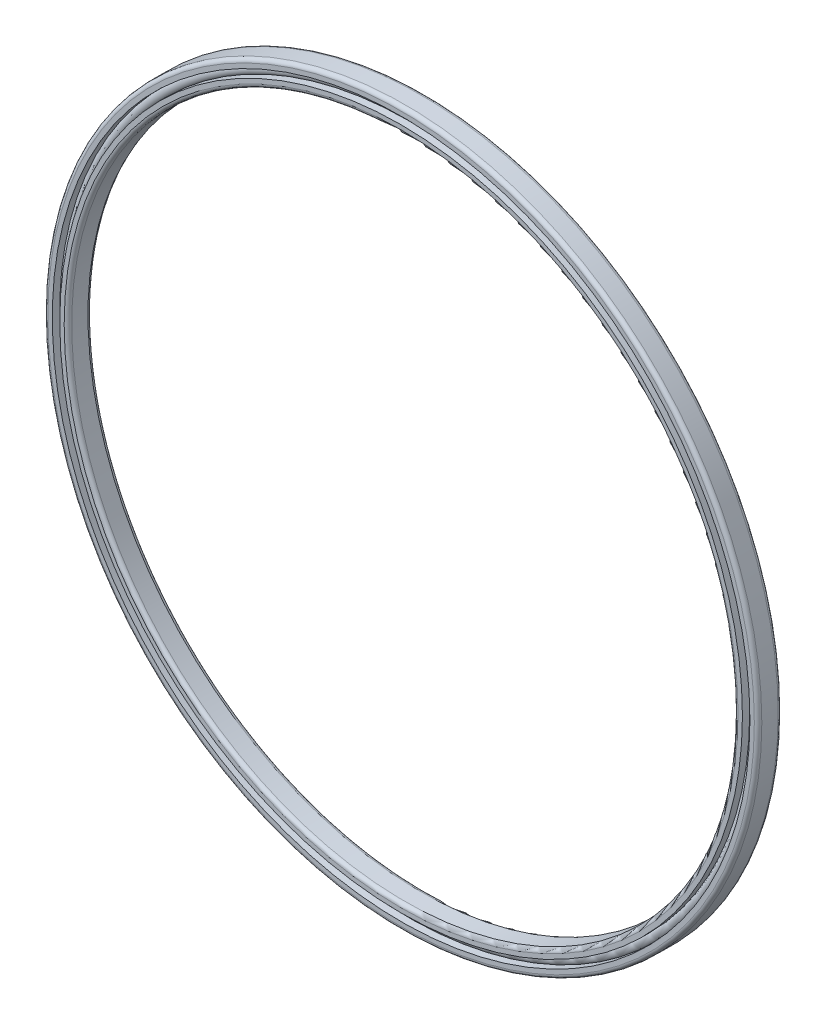
ISO-10303-21;
HEADER;
FILE_DESCRIPTION(('STEP AP214'),'2;1');
FILE_NAME('part.step','',(''),(''),'','','');
FILE_SCHEMA(('AUTOMOTIVE_DESIGN { 1 0 10303 214 1 1 1 1 }'));
ENDSEC;
DATA;
#1=APPLICATION_CONTEXT('core data for automotive mechanical design processes');
#2=APPLICATION_PROTOCOL_DEFINITION('international standard','automotive_design',2000,#1);
#3=PRODUCT_CONTEXT('',#1,'mechanical');
#4=PRODUCT('Part','Part','',(#3));
#5=PRODUCT_RELATED_PRODUCT_CATEGORY('part','',(#4));
#6=PRODUCT_DEFINITION_FORMATION('','',#4);
#7=PRODUCT_DEFINITION_CONTEXT('part definition',#1,'design');
#8=PRODUCT_DEFINITION('design','',#6,#7);
#9=PRODUCT_DEFINITION_SHAPE('','',#8);
#10=(LENGTH_UNIT() NAMED_UNIT(*) SI_UNIT(.MILLI.,.METRE.));
#11=(NAMED_UNIT(*) PLANE_ANGLE_UNIT() SI_UNIT($,.RADIAN.));
#12=(NAMED_UNIT(*) SI_UNIT($,.STERADIAN.) SOLID_ANGLE_UNIT());
#13=UNCERTAINTY_MEASURE_WITH_UNIT(LENGTH_MEASURE(1.E-05),#10,'distance_accuracy_value','');
#14=(GEOMETRIC_REPRESENTATION_CONTEXT(3) GLOBAL_UNCERTAINTY_ASSIGNED_CONTEXT((#13)) GLOBAL_UNIT_ASSIGNED_CONTEXT((#10,
#11,#12)) REPRESENTATION_CONTEXT('',''));
#15=CARTESIAN_POINT('',(0.,0.,0.));
#16=DIRECTION('',(0.,0.,1.));
#17=DIRECTION('',(1.,0.,0.));
#18=AXIS2_PLACEMENT_3D('',#15,#16,#17);
#19=CARTESIAN_POINT('',(0.,0.,-5.34999999999971));
#20=DIRECTION('',(0.,0.,1.));
#21=DIRECTION('',(1.,0.,0.));
#22=AXIS2_PLACEMENT_3D('',#19,#20,#21);
#23=TOROIDAL_SURFACE('',#22,89.9,1.);
#24=CARTESIAN_POINT('',(0.,0.,-6.34999999999971));
#25=DIRECTION('',(0.,0.,1.));
#26=DIRECTION('',(1.,0.,0.));
#27=AXIS2_PLACEMENT_3D('',#24,#25,#26);
#28=CIRCLE('',#27,89.9);
#29=CARTESIAN_POINT('',(89.9,0.,-6.35000000000002));
#30=VERTEX_POINT('',#29);
#31=EDGE_CURVE('E93',#30,#30,#28,.T.);
#32=ORIENTED_EDGE('',*,*,#31,.F.);
#33=EDGE_LOOP('',(#32));
#34=FACE_BOUND('',#33,.T.);
#35=CARTESIAN_POINT('',(0.,0.,-5.34999999999971));
#36=DIRECTION('',(0.,0.,1.));
#37=DIRECTION('',(1.,0.,0.));
#38=AXIS2_PLACEMENT_3D('',#35,#36,#37);
#39=CIRCLE('',#38,88.9);
#40=CARTESIAN_POINT('',(88.9,0.,-5.35000000000002));
#41=VERTEX_POINT('',#40);
#42=EDGE_CURVE('E10',#41,#41,#39,.T.);
#43=ORIENTED_EDGE('',*,*,#42,.T.);
#44=EDGE_LOOP('',(#43));
#45=FACE_BOUND('',#44,.T.);
#46=ADVANCED_FACE('F41',(#34,#45),#23,.T.);
#47=CARTESIAN_POINT('',(0.,0.,0.));
#48=DIRECTION('',(0.,0.,1.));
#49=DIRECTION('',(1.,0.,0.));
#50=AXIS2_PLACEMENT_3D('',#47,#48,#49);
#51=CYLINDRICAL_SURFACE('',#50,88.9);
#52=ORIENTED_EDGE('',*,*,#42,.F.);
#53=EDGE_LOOP('',(#52));
#54=FACE_BOUND('',#53,.T.);
#55=CARTESIAN_POINT('',(0.,0.,-0.999999999999718));
#56=DIRECTION('',(0.,0.,1.));
#57=DIRECTION('',(1.,0.,0.));
#58=AXIS2_PLACEMENT_3D('',#55,#56,#57);
#59=CIRCLE('',#58,88.9);
#60=CARTESIAN_POINT('',(88.9,0.,-1.00000000000002));
#61=VERTEX_POINT('',#60);
#62=EDGE_CURVE('E47',#61,#61,#59,.T.);
#63=ORIENTED_EDGE('',*,*,#62,.T.);
#64=EDGE_LOOP('',(#63));
#65=FACE_BOUND('',#64,.T.);
#66=ADVANCED_FACE('F100',(#54,#65),#51,.F.);
#67=CARTESIAN_POINT('',(0.,0.,-0.999999999999708));
#68=DIRECTION('',(0.,0.,1.));
#69=DIRECTION('',(1.,0.,0.));
#70=AXIS2_PLACEMENT_3D('',#67,#68,#69);
#71=TOROIDAL_SURFACE('',#70,89.9,1.);
#72=CARTESIAN_POINT('',(0.,0.,2.92088440649926E-13));
#73=DIRECTION('',(0.,0.,1.));
#74=DIRECTION('',(1.,0.,0.));
#75=AXIS2_PLACEMENT_3D('',#72,#73,#74);
#76=CIRCLE('',#75,89.9);
#77=CARTESIAN_POINT('',(89.9,0.,0.));
#78=VERTEX_POINT('',#77);
#79=EDGE_CURVE('E51',#78,#78,#76,.T.);
#80=ORIENTED_EDGE('',*,*,#79,.T.);
#81=EDGE_LOOP('',(#80));
#82=FACE_BOUND('',#81,.T.);
#83=ORIENTED_EDGE('',*,*,#62,.F.);
#84=EDGE_LOOP('',(#83));
#85=FACE_BOUND('',#84,.T.);
#86=ADVANCED_FACE('F104',(#82,#85),#71,.T.);
#87=CARTESIAN_POINT('',(0.,0.,2.93075549130462E-13));
#88=DIRECTION('',(0.,0.,-1.));
#89=DIRECTION('',(-1.,0.,0.));
#90=AXIS2_PLACEMENT_3D('',#87,#88,#89);
#91=PLANE('',#90);
#92=ORIENTED_EDGE('',*,*,#79,.F.);
#93=EDGE_LOOP('',(#92));
#94=FACE_BOUND('',#93,.T.);
#95=CARTESIAN_POINT('',(0.,0.,2.94062657610997E-13));
#96=DIRECTION('',(0.,0.,1.));
#97=DIRECTION('',(1.,0.,0.));
#98=AXIS2_PLACEMENT_3D('',#95,#96,#97);
#99=CIRCLE('',#98,91.075);
#100=CARTESIAN_POINT('',(91.075,0.,0.));
#101=VERTEX_POINT('',#100);
#102=EDGE_CURVE('E55',#101,#101,#99,.T.);
#103=ORIENTED_EDGE('',*,*,#102,.T.);
#104=EDGE_LOOP('',(#103));
#105=FACE_BOUND('',#104,.T.);
#106=ADVANCED_FACE('F109',(#94,#105),#91,.F.);
#107=CARTESIAN_POINT('',(0.,0.,0.));
#108=DIRECTION('',(0.,0.,1.));
#109=DIRECTION('',(1.,0.,0.));
#110=AXIS2_PLACEMENT_3D('',#107,#108,#109);
#111=CYLINDRICAL_SURFACE('',#110,91.075);
#112=ORIENTED_EDGE('',*,*,#102,.F.);
#113=EDGE_LOOP('',(#112));
#114=FACE_BOUND('',#113,.T.);
#115=CARTESIAN_POINT('',(0.,0.,-1.94205383329169));
#116=DIRECTION('',(0.,0.,1.));
#117=DIRECTION('',(1.,0.,0.));
#118=AXIS2_PLACEMENT_3D('',#115,#116,#117);
#119=CIRCLE('',#118,91.075);
#120=CARTESIAN_POINT('',(91.075,0.,-1.942053833292));
#121=VERTEX_POINT('',#120);
#122=EDGE_CURVE('E60',#121,#121,#119,.T.);
#123=ORIENTED_EDGE('',*,*,#122,.T.);
#124=EDGE_LOOP('',(#123));
#125=FACE_BOUND('',#124,.T.);
#126=ADVANCED_FACE('F115',(#114,#125),#111,.T.);
#127=CARTESIAN_POINT('',(0.,0.,-3.1749999999997));
#128=DIRECTION('',(0.,0.,1.));
#129=DIRECTION('',(1.,0.,0.));
#130=AXIS2_PLACEMENT_3D('',#127,#128,#129);
#131=TOROIDAL_SURFACE('',#130,92.075,1.5875);
#132=CARTESIAN_POINT('',(0.,0.,-1.94205383329168));
#133=DIRECTION('',(0.,0.,1.));
#134=DIRECTION('',(1.,0.,0.));
#135=AXIS2_PLACEMENT_3D('',#132,#133,#134);
#136=CIRCLE('',#135,93.075);
#137=CARTESIAN_POINT('',(93.075,0.,-1.942053833292));
#138=VERTEX_POINT('',#137);
#139=EDGE_CURVE('E63',#138,#138,#136,.T.);
#140=ORIENTED_EDGE('',*,*,#139,.T.);
#141=EDGE_LOOP('',(#140));
#142=FACE_BOUND('',#141,.T.);
#143=ORIENTED_EDGE('',*,*,#122,.F.);
#144=EDGE_LOOP('',(#143));
#145=FACE_BOUND('',#144,.T.);
#146=ADVANCED_FACE('F119',(#142,#145),#131,.T.);
#147=CARTESIAN_POINT('',(0.,0.,0.));
#148=DIRECTION('',(0.,0.,1.));
#149=DIRECTION('',(1.,0.,0.));
#150=AXIS2_PLACEMENT_3D('',#147,#148,#149);
#151=CYLINDRICAL_SURFACE('',#150,93.075);
#152=ORIENTED_EDGE('',*,*,#139,.F.);
#153=EDGE_LOOP('',(#152));
#154=FACE_BOUND('',#153,.T.);
#155=CARTESIAN_POINT('',(0.,0.,3.009192353075E-13));
#156=DIRECTION('',(0.,0.,1.));
#157=DIRECTION('',(1.,0.,0.));
#158=AXIS2_PLACEMENT_3D('',#155,#156,#157);
#159=CIRCLE('',#158,93.075);
#160=CARTESIAN_POINT('',(93.075,0.,0.));
#161=VERTEX_POINT('',#160);
#162=EDGE_CURVE('E66',#161,#161,#159,.T.);
#163=ORIENTED_EDGE('',*,*,#162,.T.);
#164=EDGE_LOOP('',(#163));
#165=FACE_BOUND('',#164,.T.);
#166=ADVANCED_FACE('F121',(#154,#165),#151,.F.);
#167=CARTESIAN_POINT('',(0.,0.,3.02977003551995E-13));
#168=DIRECTION('',(0.,0.,-1.));
#169=DIRECTION('',(-1.,0.,0.));
#170=AXIS2_PLACEMENT_3D('',#167,#168,#169);
#171=PLANE('',#170);
#172=ORIENTED_EDGE('',*,*,#162,.F.);
#173=EDGE_LOOP('',(#172));
#174=FACE_BOUND('',#173,.T.);
#175=CARTESIAN_POINT('',(0.,0.,3.0503477179649E-13));
#176=DIRECTION('',(0.,0.,1.));
#177=DIRECTION('',(1.,0.,0.));
#178=AXIS2_PLACEMENT_3D('',#175,#176,#177);
#179=CIRCLE('',#178,94.25);
#180=CARTESIAN_POINT('',(94.25,0.,0.));
#181=VERTEX_POINT('',#180);
#182=EDGE_CURVE('E69',#181,#181,#179,.T.);
#183=ORIENTED_EDGE('',*,*,#182,.T.);
#184=EDGE_LOOP('',(#183));
#185=FACE_BOUND('',#184,.T.);
#186=ADVANCED_FACE('F124',(#174,#185),#171,.F.);
#187=CARTESIAN_POINT('',(0.,0.,-0.999999999999695));
#188=DIRECTION('',(0.,0.,1.));
#189=DIRECTION('',(1.,0.,0.));
#190=AXIS2_PLACEMENT_3D('',#187,#188,#189);
#191=TOROIDAL_SURFACE('',#190,94.25,1.);
#192=CARTESIAN_POINT('',(0.,0.,-0.999999999999698));
#193=DIRECTION('',(0.,0.,1.));
#194=DIRECTION('',(1.,0.,0.));
#195=AXIS2_PLACEMENT_3D('',#192,#193,#194);
#196=CIRCLE('',#195,95.25);
#197=CARTESIAN_POINT('',(95.25,0.,-1.00000000000002));
#198=VERTEX_POINT('',#197);
#199=EDGE_CURVE('E72',#198,#198,#196,.T.);
#200=ORIENTED_EDGE('',*,*,#199,.T.);
#201=EDGE_LOOP('',(#200));
#202=FACE_BOUND('',#201,.T.);
#203=ORIENTED_EDGE('',*,*,#182,.F.);
#204=EDGE_LOOP('',(#203));
#205=FACE_BOUND('',#204,.T.);
#206=ADVANCED_FACE('F128',(#202,#205),#191,.T.);
#207=CARTESIAN_POINT('',(0.,0.,0.));
#208=DIRECTION('',(0.,0.,1.));
#209=DIRECTION('',(1.,0.,0.));
#210=AXIS2_PLACEMENT_3D('',#207,#208,#209);
#211=CYLINDRICAL_SURFACE('',#210,95.25);
#212=ORIENTED_EDGE('',*,*,#199,.F.);
#213=EDGE_LOOP('',(#212));
#214=FACE_BOUND('',#213,.T.);
#215=CARTESIAN_POINT('',(0.,0.,-5.34999999999969));
#216=DIRECTION('',(0.,0.,1.));
#217=DIRECTION('',(1.,0.,0.));
#218=AXIS2_PLACEMENT_3D('',#215,#216,#217);
#219=CIRCLE('',#218,95.25);
#220=CARTESIAN_POINT('',(95.25,0.,-5.35000000000001));
#221=VERTEX_POINT('',#220);
#222=EDGE_CURVE('E75',#221,#221,#219,.T.);
#223=ORIENTED_EDGE('',*,*,#222,.T.);
#224=EDGE_LOOP('',(#223));
#225=FACE_BOUND('',#224,.T.);
#226=ADVANCED_FACE('F132',(#214,#225),#211,.T.);
#227=CARTESIAN_POINT('',(0.,0.,-5.34999999999969));
#228=DIRECTION('',(0.,0.,1.));
#229=DIRECTION('',(1.,0.,0.));
#230=AXIS2_PLACEMENT_3D('',#227,#228,#229);
#231=TOROIDAL_SURFACE('',#230,94.25,1.);
#232=CARTESIAN_POINT('',(0.,0.,-6.34999999999969));
#233=DIRECTION('',(0.,0.,1.));
#234=DIRECTION('',(1.,0.,0.));
#235=AXIS2_PLACEMENT_3D('',#232,#233,#234);
#236=CIRCLE('',#235,94.25);
#237=CARTESIAN_POINT('',(94.25,0.,-6.35000000000001));
#238=VERTEX_POINT('',#237);
#239=EDGE_CURVE('E78',#238,#238,#236,.T.);
#240=ORIENTED_EDGE('',*,*,#239,.T.);
#241=EDGE_LOOP('',(#240));
#242=FACE_BOUND('',#241,.T.);
#243=ORIENTED_EDGE('',*,*,#222,.F.);
#244=EDGE_LOOP('',(#243));
#245=FACE_BOUND('',#244,.T.);
#246=ADVANCED_FACE('F136',(#242,#245),#231,.T.);
#247=CARTESIAN_POINT('',(0.,0.,-6.34999999999969));
#248=DIRECTION('',(0.,0.,1.));
#249=DIRECTION('',(1.,0.,0.));
#250=AXIS2_PLACEMENT_3D('',#247,#248,#249);
#251=PLANE('',#250);
#252=ORIENTED_EDGE('',*,*,#239,.F.);
#253=EDGE_LOOP('',(#252));
#254=FACE_BOUND('',#253,.T.);
#255=CARTESIAN_POINT('',(0.,0.,-6.34999999999969));
#256=DIRECTION('',(0.,0.,1.));
#257=DIRECTION('',(1.,0.,0.));
#258=AXIS2_PLACEMENT_3D('',#255,#256,#257);
#259=CIRCLE('',#258,93.075);
#260=CARTESIAN_POINT('',(93.075,0.,-6.35000000000001));
#261=VERTEX_POINT('',#260);
#262=EDGE_CURVE('E81',#261,#261,#259,.T.);
#263=ORIENTED_EDGE('',*,*,#262,.T.);
#264=EDGE_LOOP('',(#263));
#265=FACE_BOUND('',#264,.T.);
#266=ADVANCED_FACE('F140',(#254,#265),#251,.F.);
#267=CARTESIAN_POINT('',(0.,0.,0.));
#268=DIRECTION('',(0.,0.,1.));
#269=DIRECTION('',(1.,0.,0.));
#270=AXIS2_PLACEMENT_3D('',#267,#268,#269);
#271=CYLINDRICAL_SURFACE('',#270,93.075);
#272=ORIENTED_EDGE('',*,*,#262,.F.);
#273=EDGE_LOOP('',(#272));
#274=FACE_BOUND('',#273,.T.);
#275=CARTESIAN_POINT('',(0.,0.,-4.40794616670772));
#276=DIRECTION('',(0.,0.,1.));
#277=DIRECTION('',(1.,0.,0.));
#278=AXIS2_PLACEMENT_3D('',#275,#276,#277);
#279=CIRCLE('',#278,93.075);
#280=CARTESIAN_POINT('',(93.075,0.,-4.40794616670804));
#281=VERTEX_POINT('',#280);
#282=EDGE_CURVE('E84',#281,#281,#279,.T.);
#283=ORIENTED_EDGE('',*,*,#282,.T.);
#284=EDGE_LOOP('',(#283));
#285=FACE_BOUND('',#284,.T.);
#286=ADVANCED_FACE('F144',(#274,#285),#271,.F.);
#287=CARTESIAN_POINT('',(0.,0.,-4.40794616670773));
#288=DIRECTION('',(0.,0.,1.));
#289=DIRECTION('',(1.,0.,0.));
#290=AXIS2_PLACEMENT_3D('',#287,#288,#289);
#291=CIRCLE('',#290,91.075);
#292=CARTESIAN_POINT('',(91.075,0.,-4.40794616670804));
#293=VERTEX_POINT('',#292);
#294=EDGE_CURVE('E87',#293,#293,#291,.T.);
#295=ORIENTED_EDGE('',*,*,#294,.T.);
#296=EDGE_LOOP('',(#295));
#297=FACE_BOUND('',#296,.T.);
#298=ORIENTED_EDGE('',*,*,#282,.F.);
#299=EDGE_LOOP('',(#298));
#300=FACE_BOUND('',#299,.T.);
#301=ADVANCED_FACE('F148',(#297,#300),#131,.T.);
#302=CARTESIAN_POINT('',(0.,0.,0.));
#303=DIRECTION('',(0.,0.,1.));
#304=DIRECTION('',(1.,0.,0.));
#305=AXIS2_PLACEMENT_3D('',#302,#303,#304);
#306=CYLINDRICAL_SURFACE('',#305,91.075);
#307=ORIENTED_EDGE('',*,*,#294,.F.);
#308=EDGE_LOOP('',(#307));
#309=FACE_BOUND('',#308,.T.);
#310=CARTESIAN_POINT('',(0.,0.,-6.34999999999971));
#311=DIRECTION('',(0.,0.,1.));
#312=DIRECTION('',(1.,0.,0.));
#313=AXIS2_PLACEMENT_3D('',#310,#311,#312);
#314=CIRCLE('',#313,91.075);
#315=CARTESIAN_POINT('',(91.075,0.,-6.35000000000002));
#316=VERTEX_POINT('',#315);
#317=EDGE_CURVE('E90',#316,#316,#314,.T.);
#318=ORIENTED_EDGE('',*,*,#317,.T.);
#319=EDGE_LOOP('',(#318));
#320=FACE_BOUND('',#319,.T.);
#321=ADVANCED_FACE('F152',(#309,#320),#306,.T.);
#322=CARTESIAN_POINT('',(0.,0.,-6.34999999999971));
#323=DIRECTION('',(0.,0.,1.));
#324=DIRECTION('',(1.,0.,0.));
#325=AXIS2_PLACEMENT_3D('',#322,#323,#324);
#326=PLANE('',#325);
#327=ORIENTED_EDGE('',*,*,#317,.F.);
#328=EDGE_LOOP('',(#327));
#329=FACE_BOUND('',#328,.T.);
#330=ORIENTED_EDGE('',*,*,#31,.T.);
#331=EDGE_LOOP('',(#330));
#332=FACE_BOUND('',#331,.T.);
#333=ADVANCED_FACE('F97',(#329,#332),#326,.F.);
#334=CLOSED_SHELL('',(#46,#66,#86,#106,#126,#146,#166,#186,#206,#226,#246,#266,#286,#301,#321,#333));
#335=MANIFOLD_SOLID_BREP('B2',#334);
#336=ADVANCED_BREP_SHAPE_REPRESENTATION('',(#18,#335),#14);
#337=SHAPE_DEFINITION_REPRESENTATION(#9,#336);
ENDSEC;
END-ISO-10303-21;
